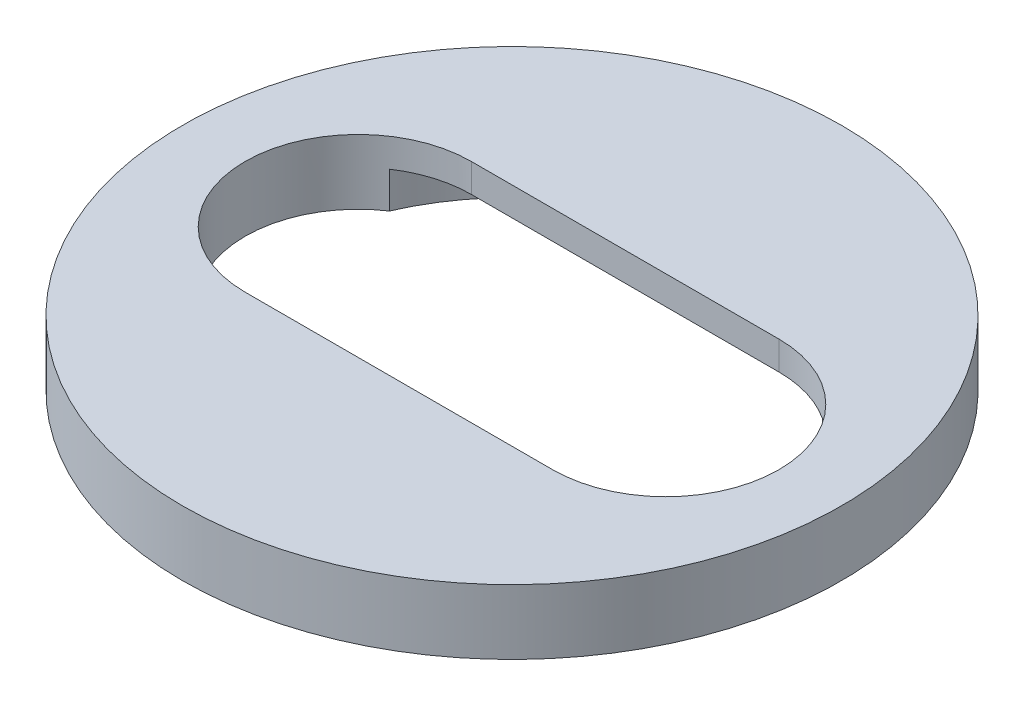
ISO-10303-21;
HEADER;
FILE_DESCRIPTION(('STEP AP214'),'2;1');
FILE_NAME('part.step','',(''),(''),'','','');
FILE_SCHEMA(('AUTOMOTIVE_DESIGN { 1 0 10303 214 1 1 1 1 }'));
ENDSEC;
DATA;
#1=APPLICATION_CONTEXT('core data for automotive mechanical design processes');
#2=APPLICATION_PROTOCOL_DEFINITION('international standard','automotive_design',2000,#1);
#3=PRODUCT_CONTEXT('',#1,'mechanical');
#4=PRODUCT('Part','Part','',(#3));
#5=PRODUCT_RELATED_PRODUCT_CATEGORY('part','',(#4));
#6=PRODUCT_DEFINITION_FORMATION('','',#4);
#7=PRODUCT_DEFINITION_CONTEXT('part definition',#1,'design');
#8=PRODUCT_DEFINITION('design','',#6,#7);
#9=PRODUCT_DEFINITION_SHAPE('','',#8);
#10=(LENGTH_UNIT() NAMED_UNIT(*) SI_UNIT(.MILLI.,.METRE.));
#11=(NAMED_UNIT(*) PLANE_ANGLE_UNIT() SI_UNIT($,.RADIAN.));
#12=(NAMED_UNIT(*) SI_UNIT($,.STERADIAN.) SOLID_ANGLE_UNIT());
#13=UNCERTAINTY_MEASURE_WITH_UNIT(LENGTH_MEASURE(1.E-05),#10,'distance_accuracy_value','');
#14=(GEOMETRIC_REPRESENTATION_CONTEXT(3) GLOBAL_UNCERTAINTY_ASSIGNED_CONTEXT((#13)) GLOBAL_UNIT_ASSIGNED_CONTEXT((#10,
#11,#12)) REPRESENTATION_CONTEXT('',''));
#15=CARTESIAN_POINT('',(0.,0.,0.));
#16=DIRECTION('',(0.,0.,1.));
#17=DIRECTION('',(1.,0.,0.));
#18=AXIS2_PLACEMENT_3D('',#15,#16,#17);
#19=CARTESIAN_POINT('',(0.,-1.65,0.));
#20=DIRECTION('',(0.,1.,0.));
#21=DIRECTION('',(0.,0.,1.));
#22=AXIS2_PLACEMENT_3D('',#19,#20,#21);
#23=CYLINDRICAL_SURFACE('',#22,10.75);
#24=CARTESIAN_POINT('',(0.,-1.65,0.));
#25=DIRECTION('',(0.,1.,0.));
#26=DIRECTION('',(0.,0.,1.));
#27=AXIS2_PLACEMENT_3D('',#24,#25,#26);
#28=CIRCLE('',#27,10.75);
#29=CARTESIAN_POINT('',(-9.86,-1.65,4.28286119317449));
#30=VERTEX_POINT('',#29);
#31=CARTESIAN_POINT('',(9.86,-1.65,4.28286119317449));
#32=VERTEX_POINT('',#31);
#33=EDGE_CURVE('E203',#30,#32,#28,.T.);
#34=ORIENTED_EDGE('',*,*,#33,.F.);
#35=DIRECTION('',(0.,1.,0.));
#36=VECTOR('',#35,1.);
#37=CARTESIAN_POINT('',(-9.86,-1.2,4.28286119317449));
#38=LINE('',#37,#36);
#39=CARTESIAN_POINT('',(-9.86,0.,4.28286119317449));
#40=VERTEX_POINT('',#39);
#41=EDGE_CURVE('E191',#30,#40,#38,.T.);
#42=ORIENTED_EDGE('',*,*,#41,.T.);
#43=CARTESIAN_POINT('',(0.,0.,0.));
#44=DIRECTION('',(0.,1.,0.));
#45=DIRECTION('',(0.,0.,1.));
#46=AXIS2_PLACEMENT_3D('',#43,#44,#45);
#47=CIRCLE('',#46,10.75);
#48=CARTESIAN_POINT('',(9.86,0.,4.28286119317449));
#49=VERTEX_POINT('',#48);
#50=EDGE_CURVE('E216',#40,#49,#47,.T.);
#51=ORIENTED_EDGE('',*,*,#50,.T.);
#52=DIRECTION('',(0.,1.,0.));
#53=VECTOR('',#52,1.);
#54=CARTESIAN_POINT('',(9.86,-1.2,4.28286119317449));
#55=LINE('',#54,#53);
#56=EDGE_CURVE('E187',#49,#32,#55,.F.);
#57=ORIENTED_EDGE('',*,*,#56,.T.);
#58=EDGE_LOOP('',(#34,#42,#51,#57));
#59=FACE_BOUND('',#58,.T.);
#60=ADVANCED_FACE('F77',(#59),#23,.F.);
#61=CARTESIAN_POINT('',(0.,0.,0.));
#62=DIRECTION('',(0.,1.,0.));
#63=DIRECTION('',(0.,0.,1.));
#64=AXIS2_PLACEMENT_3D('',#61,#62,#63);
#65=PLANE('',#64);
#66=DIRECTION('',(-1.,0.,0.));
#67=VECTOR('',#66,1.);
#68=CARTESIAN_POINT('',(0.,0.,-5.15));
#69=LINE('',#68,#67);
#70=CARTESIAN_POINT('',(7.,0.,-5.15000000000001));
#71=VERTEX_POINT('',#70);
#72=CARTESIAN_POINT('',(-7.,0.,-5.15));
#73=VERTEX_POINT('',#72);
#74=EDGE_CURVE('E81',#71,#73,#69,.T.);
#75=ORIENTED_EDGE('',*,*,#74,.T.);
#76=CARTESIAN_POINT('',(-7.,0.,0.));
#77=DIRECTION('',(0.,1.,0.));
#78=DIRECTION('',(0.,0.,1.));
#79=AXIS2_PLACEMENT_3D('',#76,#77,#78);
#80=CIRCLE('',#79,5.15);
#81=CARTESIAN_POINT('',(-9.86,0.,-4.28286119317449));
#82=VERTEX_POINT('',#81);
#83=EDGE_CURVE('E12',#73,#82,#80,.T.);
#84=ORIENTED_EDGE('',*,*,#83,.T.);
#85=CARTESIAN_POINT('',(9.86,0.,-4.2828611931745));
#86=VERTEX_POINT('',#85);
#87=EDGE_CURVE('E220',#86,#82,#47,.T.);
#88=ORIENTED_EDGE('',*,*,#87,.F.);
#89=CARTESIAN_POINT('',(7.,0.,0.));
#90=DIRECTION('',(0.,1.,0.));
#91=DIRECTION('',(0.,0.,1.));
#92=AXIS2_PLACEMENT_3D('',#89,#90,#91);
#93=CIRCLE('',#92,5.15);
#94=EDGE_CURVE('E225',#86,#71,#93,.T.);
#95=ORIENTED_EDGE('',*,*,#94,.T.);
#96=EDGE_LOOP('',(#75,#84,#88,#95));
#97=FACE_BOUND('',#96,.T.);
#98=ADVANCED_FACE('F236',(#97),#65,.F.);
#99=CARTESIAN_POINT('',(0.,1.3,0.));
#100=DIRECTION('',(0.,-1.,0.));
#101=DIRECTION('',(0.,0.,-1.));
#102=AXIS2_PLACEMENT_3D('',#99,#100,#101);
#103=CYLINDRICAL_SURFACE('',#102,15.);
#104=CARTESIAN_POINT('',(0.,1.3,0.));
#105=DIRECTION('',(0.,1.,0.));
#106=DIRECTION('',(0.,0.,1.));
#107=AXIS2_PLACEMENT_3D('',#104,#105,#106);
#108=CIRCLE('',#107,15.);
#109=CARTESIAN_POINT('',(0.,1.3,15.));
#110=VERTEX_POINT('',#109);
#111=EDGE_CURVE('E212',#110,#110,#108,.T.);
#112=ORIENTED_EDGE('',*,*,#111,.F.);
#113=EDGE_LOOP('',(#112));
#114=FACE_BOUND('',#113,.T.);
#115=CARTESIAN_POINT('',(0.,-1.65,0.));
#116=DIRECTION('',(0.,1.,0.));
#117=DIRECTION('',(0.,0.,1.));
#118=AXIS2_PLACEMENT_3D('',#115,#116,#117);
#119=CIRCLE('',#118,15.);
#120=CARTESIAN_POINT('',(0.,-1.65,15.));
#121=VERTEX_POINT('',#120);
#122=EDGE_CURVE('E208',#121,#121,#119,.T.);
#123=ORIENTED_EDGE('',*,*,#122,.T.);
#124=EDGE_LOOP('',(#123));
#125=FACE_BOUND('',#124,.T.);
#126=ADVANCED_FACE('F79',(#114,#125),#103,.T.);
#127=CARTESIAN_POINT('',(0.,1.3,0.));
#128=DIRECTION('',(0.,1.,0.));
#129=DIRECTION('',(0.,0.,1.));
#130=AXIS2_PLACEMENT_3D('',#127,#128,#129);
#131=PLANE('',#130);
#132=CARTESIAN_POINT('',(-7.,1.3,0.));
#133=DIRECTION('',(0.,1.,0.));
#134=DIRECTION('',(0.,0.,1.));
#135=AXIS2_PLACEMENT_3D('',#132,#133,#134);
#136=CIRCLE('',#135,5.15);
#137=CARTESIAN_POINT('',(-7.,1.3,-5.15));
#138=VERTEX_POINT('',#137);
#139=CARTESIAN_POINT('',(-7.,1.3,5.15));
#140=VERTEX_POINT('',#139);
#141=EDGE_CURVE('E94',#138,#140,#136,.T.);
#142=ORIENTED_EDGE('',*,*,#141,.F.);
#143=DIRECTION('',(-1.,0.,0.));
#144=VECTOR('',#143,1.);
#145=CARTESIAN_POINT('',(0.,1.3,-5.15));
#146=LINE('',#145,#144);
#147=CARTESIAN_POINT('',(7.,1.3,-5.15000000000001));
#148=VERTEX_POINT('',#147);
#149=EDGE_CURVE('E165',#148,#138,#146,.T.);
#150=ORIENTED_EDGE('',*,*,#149,.F.);
#151=CARTESIAN_POINT('',(7.,1.3,0.));
#152=DIRECTION('',(0.,1.,0.));
#153=DIRECTION('',(0.,0.,1.));
#154=AXIS2_PLACEMENT_3D('',#151,#152,#153);
#155=CIRCLE('',#154,5.15);
#156=CARTESIAN_POINT('',(7.,1.3,5.15));
#157=VERTEX_POINT('',#156);
#158=EDGE_CURVE('E147',#157,#148,#155,.T.);
#159=ORIENTED_EDGE('',*,*,#158,.F.);
#160=DIRECTION('',(-1.,0.,0.));
#161=VECTOR('',#160,1.);
#162=CARTESIAN_POINT('',(0.,1.3,5.15));
#163=LINE('',#162,#161);
#164=EDGE_CURVE('E157',#157,#140,#163,.T.);
#165=ORIENTED_EDGE('',*,*,#164,.T.);
#166=EDGE_LOOP('',(#142,#150,#159,#165));
#167=FACE_BOUND('',#166,.T.);
#168=ORIENTED_EDGE('',*,*,#111,.T.);
#169=EDGE_LOOP('',(#168));
#170=FACE_BOUND('',#169,.T.);
#171=ADVANCED_FACE('F162',(#167,#170),#131,.T.);
#172=CARTESIAN_POINT('',(0.,-1.65,0.));
#173=DIRECTION('',(0.,1.,0.));
#174=DIRECTION('',(0.,0.,1.));
#175=AXIS2_PLACEMENT_3D('',#172,#173,#174);
#176=PLANE('',#175);
#177=CARTESIAN_POINT('',(9.86,-1.65,-4.2828611931745));
#178=VERTEX_POINT('',#177);
#179=CARTESIAN_POINT('',(-9.86,-1.65,-4.28286119317449));
#180=VERTEX_POINT('',#179);
#181=EDGE_CURVE('E207',#178,#180,#28,.T.);
#182=ORIENTED_EDGE('',*,*,#181,.T.);
#183=CARTESIAN_POINT('',(-7.,-1.65,0.));
#184=DIRECTION('',(0.,1.,0.));
#185=DIRECTION('',(0.,0.,1.));
#186=AXIS2_PLACEMENT_3D('',#183,#184,#185);
#187=CIRCLE('',#186,5.15);
#188=EDGE_CURVE('E195',#180,#30,#187,.T.);
#189=ORIENTED_EDGE('',*,*,#188,.T.);
#190=ORIENTED_EDGE('',*,*,#33,.T.);
#191=CARTESIAN_POINT('',(7.,-1.65,0.));
#192=DIRECTION('',(0.,1.,0.));
#193=DIRECTION('',(0.,0.,1.));
#194=AXIS2_PLACEMENT_3D('',#191,#192,#193);
#195=CIRCLE('',#194,5.15);
#196=EDGE_CURVE('E183',#32,#178,#195,.T.);
#197=ORIENTED_EDGE('',*,*,#196,.T.);
#198=EDGE_LOOP('',(#182,#189,#190,#197));
#199=FACE_BOUND('',#198,.T.);
#200=ORIENTED_EDGE('',*,*,#122,.F.);
#201=EDGE_LOOP('',(#200));
#202=FACE_BOUND('',#201,.T.);
#203=ADVANCED_FACE('F248',(#199,#202),#176,.F.);
#204=ORIENTED_EDGE('',*,*,#87,.T.);
#205=DIRECTION('',(0.,1.,0.));
#206=VECTOR('',#205,1.);
#207=CARTESIAN_POINT('',(-9.86,-1.2,-4.28286119317449));
#208=LINE('',#207,#206);
#209=EDGE_CURVE('E199',#82,#180,#208,.F.);
#210=ORIENTED_EDGE('',*,*,#209,.T.);
#211=ORIENTED_EDGE('',*,*,#181,.F.);
#212=DIRECTION('',(0.,1.,0.));
#213=VECTOR('',#212,1.);
#214=CARTESIAN_POINT('',(9.86,-1.2,-4.2828611931745));
#215=LINE('',#214,#213);
#216=EDGE_CURVE('E175',#178,#86,#215,.T.);
#217=ORIENTED_EDGE('',*,*,#216,.T.);
#218=EDGE_LOOP('',(#204,#210,#211,#217));
#219=FACE_BOUND('',#218,.T.);
#220=ADVANCED_FACE('F243',(#219),#23,.F.);
#221=ORIENTED_EDGE('',*,*,#50,.F.);
#222=CARTESIAN_POINT('',(-7.,0.,5.15));
#223=VERTEX_POINT('',#222);
#224=EDGE_CURVE('E87',#40,#223,#80,.T.);
#225=ORIENTED_EDGE('',*,*,#224,.T.);
#226=DIRECTION('',(-1.,0.,0.));
#227=VECTOR('',#226,1.);
#228=CARTESIAN_POINT('',(0.,0.,5.15));
#229=LINE('',#228,#227);
#230=CARTESIAN_POINT('',(7.,0.,5.15));
#231=VERTEX_POINT('',#230);
#232=EDGE_CURVE('E221',#231,#223,#229,.T.);
#233=ORIENTED_EDGE('',*,*,#232,.F.);
#234=EDGE_CURVE('E150',#231,#49,#93,.T.);
#235=ORIENTED_EDGE('',*,*,#234,.T.);
#236=EDGE_LOOP('',(#221,#225,#233,#235));
#237=FACE_BOUND('',#236,.T.);
#238=ADVANCED_FACE('F252',(#237),#65,.F.);
#239=CARTESIAN_POINT('',(-7.,-3.7,0.));
#240=DIRECTION('',(0.,1.,0.));
#241=DIRECTION('',(0.,0.,1.));
#242=AXIS2_PLACEMENT_3D('',#239,#240,#241);
#243=CYLINDRICAL_SURFACE('',#242,5.15);
#244=DIRECTION('',(0.,1.,0.));
#245=VECTOR('',#244,1.);
#246=CARTESIAN_POINT('',(-7.,-3.7,-5.15));
#247=LINE('',#246,#245);
#248=EDGE_CURVE('E172',#73,#138,#247,.T.);
#249=ORIENTED_EDGE('',*,*,#248,.T.);
#250=ORIENTED_EDGE('',*,*,#141,.T.);
#251=DIRECTION('',(0.,1.,0.));
#252=VECTOR('',#251,1.);
#253=CARTESIAN_POINT('',(-7.,-3.7,5.15));
#254=LINE('',#253,#252);
#255=EDGE_CURVE('E154',#223,#140,#254,.T.);
#256=ORIENTED_EDGE('',*,*,#255,.F.);
#257=ORIENTED_EDGE('',*,*,#224,.F.);
#258=ORIENTED_EDGE('',*,*,#41,.F.);
#259=ORIENTED_EDGE('',*,*,#188,.F.);
#260=ORIENTED_EDGE('',*,*,#209,.F.);
#261=ORIENTED_EDGE('',*,*,#83,.F.);
#262=EDGE_LOOP('',(#249,#250,#256,#257,#258,#259,#260,#261));
#263=FACE_BOUND('',#262,.T.);
#264=ADVANCED_FACE('F253',(#263),#243,.F.);
#265=CARTESIAN_POINT('',(0.,-3.7,-5.15));
#266=DIRECTION('',(0.,0.,-1.));
#267=DIRECTION('',(-1.,0.,0.));
#268=AXIS2_PLACEMENT_3D('',#265,#266,#267);
#269=PLANE('',#268);
#270=DIRECTION('',(0.,1.,0.));
#271=VECTOR('',#270,1.);
#272=CARTESIAN_POINT('',(7.,-3.7,-5.15000000000001));
#273=LINE('',#272,#271);
#274=EDGE_CURVE('E153',#71,#148,#273,.T.);
#275=ORIENTED_EDGE('',*,*,#274,.T.);
#276=ORIENTED_EDGE('',*,*,#149,.T.);
#277=ORIENTED_EDGE('',*,*,#248,.F.);
#278=ORIENTED_EDGE('',*,*,#74,.F.);
#279=EDGE_LOOP('',(#275,#276,#277,#278));
#280=FACE_BOUND('',#279,.T.);
#281=ADVANCED_FACE('F240',(#280),#269,.F.);
#282=CARTESIAN_POINT('',(7.,-3.7,0.));
#283=DIRECTION('',(0.,1.,0.));
#284=DIRECTION('',(0.,0.,1.));
#285=AXIS2_PLACEMENT_3D('',#282,#283,#284);
#286=CYLINDRICAL_SURFACE('',#285,5.15);
#287=DIRECTION('',(0.,1.,0.));
#288=VECTOR('',#287,1.);
#289=CARTESIAN_POINT('',(7.,-3.7,5.15));
#290=LINE('',#289,#288);
#291=EDGE_CURVE('E102',#231,#157,#290,.T.);
#292=ORIENTED_EDGE('',*,*,#291,.T.);
#293=ORIENTED_EDGE('',*,*,#158,.T.);
#294=ORIENTED_EDGE('',*,*,#274,.F.);
#295=ORIENTED_EDGE('',*,*,#94,.F.);
#296=ORIENTED_EDGE('',*,*,#216,.F.);
#297=ORIENTED_EDGE('',*,*,#196,.F.);
#298=ORIENTED_EDGE('',*,*,#56,.F.);
#299=ORIENTED_EDGE('',*,*,#234,.F.);
#300=EDGE_LOOP('',(#292,#293,#294,#295,#296,#297,#298,#299));
#301=FACE_BOUND('',#300,.T.);
#302=ADVANCED_FACE('F144',(#301),#286,.F.);
#303=CARTESIAN_POINT('',(0.,-3.7,5.15));
#304=DIRECTION('',(0.,0.,-1.));
#305=DIRECTION('',(-1.,0.,0.));
#306=AXIS2_PLACEMENT_3D('',#303,#304,#305);
#307=PLANE('',#306);
#308=ORIENTED_EDGE('',*,*,#232,.T.);
#309=ORIENTED_EDGE('',*,*,#255,.T.);
#310=ORIENTED_EDGE('',*,*,#164,.F.);
#311=ORIENTED_EDGE('',*,*,#291,.F.);
#312=EDGE_LOOP('',(#308,#309,#310,#311));
#313=FACE_BOUND('',#312,.T.);
#314=ADVANCED_FACE('F158',(#313),#307,.T.);
#315=CLOSED_SHELL('',(#60,#98,#126,#171,#203,#220,#238,#264,#281,#302,#314));
#316=MANIFOLD_SOLID_BREP('B2',#315);
#317=ADVANCED_BREP_SHAPE_REPRESENTATION('',(#18,#316),#14);
#318=SHAPE_DEFINITION_REPRESENTATION(#9,#317);
ENDSEC;
END-ISO-10303-21;
